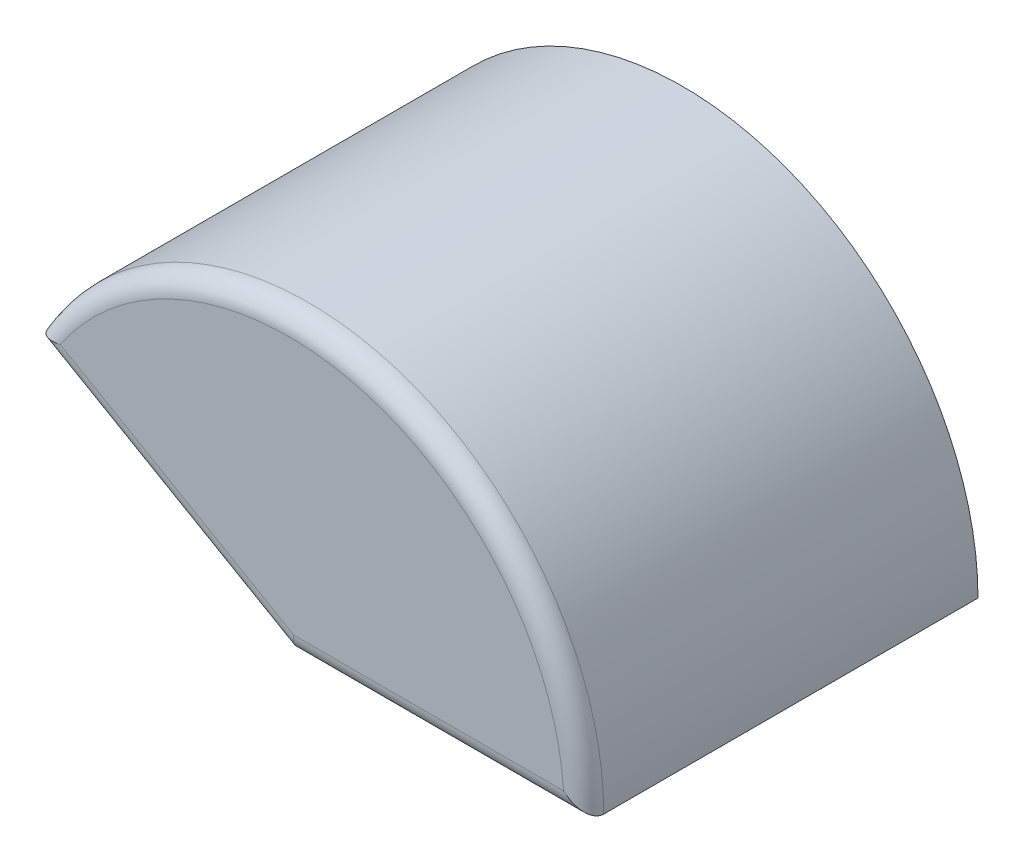
ISO-10303-21;
HEADER;
FILE_DESCRIPTION(('STEP AP214'),'2;1');
FILE_NAME('part.step','',(''),(''),'','','');
FILE_SCHEMA(('AUTOMOTIVE_DESIGN { 1 0 10303 214 1 1 1 1 }'));
ENDSEC;
DATA;
#1=APPLICATION_CONTEXT('core data for automotive mechanical design processes');
#2=APPLICATION_PROTOCOL_DEFINITION('international standard','automotive_design',2000,#1);
#3=PRODUCT_CONTEXT('',#1,'mechanical');
#4=PRODUCT('Part','Part','',(#3));
#5=PRODUCT_RELATED_PRODUCT_CATEGORY('part','',(#4));
#6=PRODUCT_DEFINITION_FORMATION('','',#4);
#7=PRODUCT_DEFINITION_CONTEXT('part definition',#1,'design');
#8=PRODUCT_DEFINITION('design','',#6,#7);
#9=PRODUCT_DEFINITION_SHAPE('','',#8);
#10=(LENGTH_UNIT() NAMED_UNIT(*) SI_UNIT(.MILLI.,.METRE.));
#11=(NAMED_UNIT(*) PLANE_ANGLE_UNIT() SI_UNIT($,.RADIAN.));
#12=(NAMED_UNIT(*) SI_UNIT($,.STERADIAN.) SOLID_ANGLE_UNIT());
#13=UNCERTAINTY_MEASURE_WITH_UNIT(LENGTH_MEASURE(1.E-05),#10,'distance_accuracy_value','');
#14=(GEOMETRIC_REPRESENTATION_CONTEXT(3) GLOBAL_UNCERTAINTY_ASSIGNED_CONTEXT((#13)) GLOBAL_UNIT_ASSIGNED_CONTEXT((#10,
#11,#12)) REPRESENTATION_CONTEXT('',''));
#15=CARTESIAN_POINT('',(0.,0.,0.));
#16=DIRECTION('',(0.,0.,1.));
#17=DIRECTION('',(1.,0.,0.));
#18=AXIS2_PLACEMENT_3D('',#15,#16,#17);
#19=CARTESIAN_POINT('',(0.,0.,40.));
#20=DIRECTION('',(0.,1.,0.));
#21=DIRECTION('',(0.,0.,1.));
#22=AXIS2_PLACEMENT_3D('',#19,#20,#21);
#23=PLANE('',#22);
#24=DIRECTION('',(0.,0.,-1.));
#25=VECTOR('',#24,1.);
#26=CARTESIAN_POINT('',(30.,0.,40.));
#27=LINE('',#26,#25);
#28=CARTESIAN_POINT('',(30.,0.,38.));
#29=VERTEX_POINT('',#28);
#30=CARTESIAN_POINT('',(30.,0.,0.));
#31=VERTEX_POINT('',#30);
#32=EDGE_CURVE('E96',#29,#31,#27,.T.);
#33=ORIENTED_EDGE('',*,*,#32,.F.);
#34=DIRECTION('',(1.,0.,0.));
#35=VECTOR('',#34,1.);
#36=CARTESIAN_POINT('',(0.,0.,38.));
#37=LINE('',#36,#35);
#38=CARTESIAN_POINT('',(0.,0.,38.));
#39=VERTEX_POINT('',#38);
#40=EDGE_CURVE('E11',#29,#39,#37,.F.);
#41=ORIENTED_EDGE('',*,*,#40,.T.);
#42=DIRECTION('',(0.,0.,-1.));
#43=VECTOR('',#42,1.);
#44=CARTESIAN_POINT('',(0.,0.,40.));
#45=LINE('',#44,#43);
#46=CARTESIAN_POINT('',(0.,0.,0.));
#47=VERTEX_POINT('',#46);
#48=EDGE_CURVE('E117',#39,#47,#45,.T.);
#49=ORIENTED_EDGE('',*,*,#48,.T.);
#50=DIRECTION('',(1.,0.,0.));
#51=VECTOR('',#50,1.);
#52=CARTESIAN_POINT('',(0.,0.,0.));
#53=LINE('',#52,#51);
#54=EDGE_CURVE('E111',#47,#31,#53,.T.);
#55=ORIENTED_EDGE('',*,*,#54,.T.);
#56=EDGE_LOOP('',(#33,#41,#49,#55));
#57=FACE_BOUND('',#56,.T.);
#58=ADVANCED_FACE('F45',(#57),#23,.F.);
#59=CARTESIAN_POINT('',(0.,0.,40.));
#60=DIRECTION('',(0.,0.,-1.));
#61=DIRECTION('',(-1.,0.,0.));
#62=AXIS2_PLACEMENT_3D('',#59,#60,#61);
#63=CYLINDRICAL_SURFACE('',#62,30.);
#64=DIRECTION('',(0.,0.,-1.));
#65=VECTOR('',#64,1.);
#66=CARTESIAN_POINT('',(-25.9807621135331,15.,40.));
#67=LINE('',#66,#65);
#68=CARTESIAN_POINT('',(-25.9807621135331,15.,38.));
#69=VERTEX_POINT('',#68);
#70=CARTESIAN_POINT('',(-25.9807621135331,15.,0.));
#71=VERTEX_POINT('',#70);
#72=EDGE_CURVE('E106',#69,#71,#67,.T.);
#73=ORIENTED_EDGE('',*,*,#72,.F.);
#74=CARTESIAN_POINT('',(0.,0.,38.));
#75=DIRECTION('',(0.,0.,1.));
#76=DIRECTION('',(1.,0.,0.));
#77=AXIS2_PLACEMENT_3D('',#74,#75,#76);
#78=CIRCLE('',#77,30.);
#79=EDGE_CURVE('E61',#69,#29,#78,.F.);
#80=ORIENTED_EDGE('',*,*,#79,.T.);
#81=ORIENTED_EDGE('',*,*,#32,.T.);
#82=CARTESIAN_POINT('',(0.,0.,0.));
#83=DIRECTION('',(0.,0.,1.));
#84=DIRECTION('',(1.,0.,0.));
#85=AXIS2_PLACEMENT_3D('',#82,#83,#84);
#86=CIRCLE('',#85,30.);
#87=EDGE_CURVE('E99',#31,#71,#86,.T.);
#88=ORIENTED_EDGE('',*,*,#87,.T.);
#89=EDGE_LOOP('',(#73,#80,#81,#88));
#90=FACE_BOUND('',#89,.T.);
#91=ADVANCED_FACE('F98',(#90),#63,.T.);
#92=CARTESIAN_POINT('',(-25.9807621135331,15.,40.));
#93=DIRECTION('',(0.500000000000001,0.866025403784438,0.));
#94=DIRECTION('',(-0.866025403784438,0.500000000000001,0.));
#95=AXIS2_PLACEMENT_3D('',#92,#93,#94);
#96=PLANE('',#95);
#97=ORIENTED_EDGE('',*,*,#48,.F.);
#98=DIRECTION('',(0.866025403784438,-0.500000000000001,0.));
#99=VECTOR('',#98,1.);
#100=CARTESIAN_POINT('',(-25.9807621135331,15.,38.));
#101=LINE('',#100,#99);
#102=EDGE_CURVE('E138',#39,#69,#101,.F.);
#103=ORIENTED_EDGE('',*,*,#102,.T.);
#104=ORIENTED_EDGE('',*,*,#72,.T.);
#105=DIRECTION('',(0.866025403784438,-0.500000000000001,0.));
#106=VECTOR('',#105,1.);
#107=CARTESIAN_POINT('',(-25.9807621135331,15.,0.));
#108=LINE('',#107,#106);
#109=EDGE_CURVE('E113',#71,#47,#108,.T.);
#110=ORIENTED_EDGE('',*,*,#109,.T.);
#111=EDGE_LOOP('',(#97,#103,#104,#110));
#112=FACE_BOUND('',#111,.T.);
#113=ADVANCED_FACE('F166',(#112),#96,.F.);
#114=CARTESIAN_POINT('',(0.,0.,40.));
#115=DIRECTION('',(0.,0.,1.));
#116=DIRECTION('',(1.,0.,0.));
#117=AXIS2_PLACEMENT_3D('',#114,#115,#116);
#118=PLANE('',#117);
#119=CARTESIAN_POINT('',(0.,0.,40.));
#120=DIRECTION('',(0.,0.,1.));
#121=DIRECTION('',(1.,0.,0.));
#122=AXIS2_PLACEMENT_3D('',#119,#120,#121);
#123=CIRCLE('',#122,28.);
#124=CARTESIAN_POINT('',(27.9284800875379,2.,40.));
#125=VERTEX_POINT('',#124);
#126=CARTESIAN_POINT('',(-23.1867732448956,15.6962908513378,40.));
#127=VERTEX_POINT('',#126);
#128=EDGE_CURVE('E131',#125,#127,#123,.T.);
#129=ORIENTED_EDGE('',*,*,#128,.T.);
#130=DIRECTION('',(0.866025403784438,-0.500000000000001,0.));
#131=VECTOR('',#130,1.);
#132=CARTESIAN_POINT('',(1.,1.73205080756888,40.));
#133=LINE('',#132,#131);
#134=CARTESIAN_POINT('',(0.535898384862254,2.,40.));
#135=VERTEX_POINT('',#134);
#136=EDGE_CURVE('E134',#127,#135,#133,.T.);
#137=ORIENTED_EDGE('',*,*,#136,.T.);
#138=DIRECTION('',(1.,0.,0.));
#139=VECTOR('',#138,1.);
#140=CARTESIAN_POINT('',(30.,2.,40.));
#141=LINE('',#140,#139);
#142=EDGE_CURVE('E105',#135,#125,#141,.T.);
#143=ORIENTED_EDGE('',*,*,#142,.T.);
#144=EDGE_LOOP('',(#129,#137,#143));
#145=FACE_BOUND('',#144,.T.);
#146=ADVANCED_FACE('F171',(#145),#118,.T.);
#147=CARTESIAN_POINT('',(0.,0.,0.));
#148=DIRECTION('',(0.,0.,1.));
#149=DIRECTION('',(1.,0.,0.));
#150=AXIS2_PLACEMENT_3D('',#147,#148,#149);
#151=PLANE('',#150);
#152=ORIENTED_EDGE('',*,*,#54,.F.);
#153=ORIENTED_EDGE('',*,*,#109,.F.);
#154=ORIENTED_EDGE('',*,*,#87,.F.);
#155=EDGE_LOOP('',(#152,#153,#154));
#156=FACE_BOUND('',#155,.T.);
#157=ADVANCED_FACE('F110',(#156),#151,.F.);
#158=CARTESIAN_POINT('',(0.,0.,38.));
#159=DIRECTION('',(0.,0.,1.));
#160=DIRECTION('',(1.,0.,0.));
#161=AXIS2_PLACEMENT_3D('',#158,#159,#160);
#162=TOROIDAL_SURFACE('',#161,28.,2.);
#163=CARTESIAN_POINT('',(-25.9807621135331,15.,38.));
#164=CARTESIAN_POINT('',(-25.9807768607065,14.9999957131051,38.0447211538198));
#165=CARTESIAN_POINT('',(-25.9787136001139,15.0005488904247,38.0894339981516));
#166=CARTESIAN_POINT('',(-25.9705446087622,15.0027372873878,38.1784293595428));
#167=CARTESIAN_POINT('',(-25.9644419275569,15.004371690761,38.2227121756812));
#168=CARTESIAN_POINT('',(-25.948374412137,15.0086717908121,38.3101373492371));
#169=CARTESIAN_POINT('',(-25.938442116244,15.0113287985946,38.3532861281529));
#170=CARTESIAN_POINT('',(-25.9149193255199,15.017615066842,38.4384940148708));
#171=CARTESIAN_POINT('',(-25.9013283332713,15.0212444595072,38.4805529736537));
#172=CARTESIAN_POINT('',(-25.8555031892532,15.0334664500465,38.6044329525649));
#173=CARTESIAN_POINT('',(-25.8181548334719,15.0434095397582,38.6842808742413));
#174=CARTESIAN_POINT('',(-25.7320295495063,15.0662544694341,38.8371489192167));
#175=CARTESIAN_POINT('',(-25.6832276624827,15.0791627696824,38.9101536369692));
#176=CARTESIAN_POINT('',(-25.5550561600951,15.1129147447849,39.0762926884686));
#177=CARTESIAN_POINT('',(-25.4712680031388,15.1348671715087,39.1657969945517));
#178=CARTESIAN_POINT('',(-25.2908441592374,15.1817859162308,39.3297433978041));
#179=CARTESIAN_POINT('',(-25.194184621506,15.2067578212521,39.4041568695761));
#180=CARTESIAN_POINT('',(-24.9513933034709,15.2689597231072,39.5655140083165));
#181=CARTESIAN_POINT('',(-24.800932555361,15.3070990029546,39.6455730450071));
#182=CARTESIAN_POINT('',(-24.4894847479776,15.3850143049846,39.7801432448796));
#183=CARTESIAN_POINT('',(-24.3284831267762,15.4247925620192,39.834618178019));
#184=CARTESIAN_POINT('',(-24.0064866118812,15.5032328478875,39.9186804824366));
#185=CARTESIAN_POINT('',(-23.8456985993334,15.5418837395817,39.9490904229671));
#186=CARTESIAN_POINT('',(-23.5217628569926,15.6186407476757,39.9895515876642));
#187=CARTESIAN_POINT('',(-23.358620420021,15.6567477899255,39.9996429368554));
#188=CARTESIAN_POINT('',(-23.1925917353267,15.6949525043544,39.9999968915332));
#189=CARTESIAN_POINT('',(-23.1896824825995,15.6956217697444,39.9999999943847));
#190=CARTESIAN_POINT('',(-23.1867732448956,15.6962908513378,40.));
#191=B_SPLINE_CURVE_WITH_KNOTS('',3,(#163,#164,#165,#166,#167,#168,#169,#170,#171,#172,#173,
#174,#175,#176,#177,#178,#179,#180,#181,#182,#183,#184,#185,#186,#187,#188,#189,#190),
.UNSPECIFIED.,.F.,.F.,(4,2,2,2,2,2,2,2,2,2,2,2,2,4),(0.,0.134098935404812,0.268096748334079,
0.400980282067466,0.53388189109451,0.79870811345966,1.06411687701312,1.43569690669508,
1.80797531621147,2.32909023766685,2.85094090925616,3.35407421615456,3.85621296025091,
3.86516868204515),.UNSPECIFIED.);
#192=EDGE_CURVE('E76',#127,#69,#191,.F.);
#193=ORIENTED_EDGE('',*,*,#192,.F.);
#194=ORIENTED_EDGE('',*,*,#128,.F.);
#195=CARTESIAN_POINT('',(30.,0.,38.));
#196=CARTESIAN_POINT('',(30.0000106279793,-1.10861465947106E-05,38.0447211538198));
#197=CARTESIAN_POINT('',(29.9985003805513,0.00149960976124195,38.0894339981516));
#198=CARTESIAN_POINT('',(29.992520024999,0.00747931280073649,38.1784293595428));
#199=CARTESIAN_POINT('',(29.9880521497306,0.0119460882446329,38.2227121756812));
#200=CARTESIAN_POINT('',(29.9762873232268,0.0237038418376657,38.3101373492371));
#201=CARTESIAN_POINT('',(29.9690142065568,0.0309710260217811,38.3532861281529));
#202=CARTESIAN_POINT('',(29.9517860063455,0.0481764893811488,38.4384940148708));
#203=CARTESIAN_POINT('',(29.9418305581282,0.0581151317538373,38.4805529736537));
#204=CARTESIAN_POINT('',(29.9082558145461,0.0916122580547029,38.6044329525649));
#205=CARTESIAN_POINT('',(29.8808827345057,0.118897404227776,38.6842808742413));
#206=CARTESIAN_POINT('',(29.8177185155214,0.181744335657633,38.8371489192167));
#207=CARTESIAN_POINT('',(29.7819089917305,0.217324195104081,38.9101536369692));
#208=CARTESIAN_POINT('',(29.6877852021728,0.310640014164507,39.0762926884686));
#209=CARTESIAN_POINT('',(29.6261987430743,0.37154545186026,39.1657969945517));
#210=CARTESIAN_POINT('',(29.4934064831683,0.502390198653938,39.3297433978041));
#211=CARTESIAN_POINT('',(29.4221828204855,0.572346271648987,39.4041568695761));
#212=CARTESIAN_POINT('',(29.2430203221763,0.747610357836809,39.5655140083165));
#213=CARTESIAN_POINT('',(29.1317871319644,0.855870317121655,39.6455730450071));
#214=CARTESIAN_POINT('',(28.9010230698325,1.0790708517148,39.7801432448796));
#215=CARTESIAN_POINT('',(28.7814807043389,1.19402064342571,39.834618178019));
#216=CARTESIAN_POINT('',(28.5418436854439,1.42295018111525,39.9186804824366));
#217=CARTESIAN_POINT('',(28.4219226278005,1.53681684147527,39.9490904229671));
#218=CARTESIAN_POINT('',(28.1797645497868,1.76525823157366,39.9895515876642));
#219=CARTESIAN_POINT('',(28.0575325760591,1.87983111671101,39.9996429368554));
#220=CARTESIAN_POINT('',(27.9328498745712,1.99593171229768,39.9999968915332));
#221=CARTESIAN_POINT('',(27.9306650204984,1.99796593949094,39.9999999943847));
#222=CARTESIAN_POINT('',(27.9284800875379,2.,40.));
#223=B_SPLINE_CURVE_WITH_KNOTS('',3,(#195,#196,#197,#198,#199,#200,#201,#202,#203,#204,#205,
#206,#207,#208,#209,#210,#211,#212,#213,#214,#215,#216,#217,#218,#219,#220,#221,#222),
.UNSPECIFIED.,.F.,.F.,(4,2,2,2,2,2,2,2,2,2,2,2,2,4),(0.,0.134098935404812,0.268096748334078,
0.400980282067467,0.53388189109451,0.798708113459659,1.06411687701312,1.43569690669508,
1.80797531621147,2.32909023766686,2.85094090925617,3.35407421615456,3.85621296025089,
3.86516868204514),.UNSPECIFIED.);
#224=EDGE_CURVE('E50',#29,#125,#223,.T.);
#225=ORIENTED_EDGE('',*,*,#224,.F.);
#226=ORIENTED_EDGE('',*,*,#79,.F.);
#227=EDGE_LOOP('',(#193,#194,#225,#226));
#228=FACE_BOUND('',#227,.T.);
#229=ADVANCED_FACE('F151',(#228),#162,.T.);
#230=CARTESIAN_POINT('',(0.,2.,38.));
#231=DIRECTION('',(-1.,0.,0.));
#232=DIRECTION('',(0.,0.,1.));
#233=AXIS2_PLACEMENT_3D('',#230,#231,#232);
#234=CYLINDRICAL_SURFACE('',#233,2.);
#235=ORIENTED_EDGE('',*,*,#224,.T.);
#236=ORIENTED_EDGE('',*,*,#142,.F.);
#237=CARTESIAN_POINT('',(0.535898384862253,2.,38.));
#238=DIRECTION('',(-0.965925826289068,0.258819045102521,0.));
#239=DIRECTION('',(-0.258819045102521,-0.965925826289068,0.));
#240=AXIS2_PLACEMENT_3D('',#237,#238,#239);
#241=ELLIPSE('',#240,2.07055236082017,2.);
#242=EDGE_CURVE('E144',#39,#135,#241,.T.);
#243=ORIENTED_EDGE('',*,*,#242,.F.);
#244=ORIENTED_EDGE('',*,*,#40,.F.);
#245=EDGE_LOOP('',(#235,#236,#243,#244));
#246=FACE_BOUND('',#245,.T.);
#247=ADVANCED_FACE('F47',(#246),#234,.T.);
#248=CARTESIAN_POINT('',(1.,1.73205080756888,38.));
#249=DIRECTION('',(-0.866025403784438,0.500000000000001,0.));
#250=DIRECTION('',(-0.500000000000001,-0.866025403784438,0.));
#251=AXIS2_PLACEMENT_3D('',#248,#249,#250);
#252=CYLINDRICAL_SURFACE('',#251,2.);
#253=ORIENTED_EDGE('',*,*,#192,.T.);
#254=ORIENTED_EDGE('',*,*,#102,.F.);
#255=ORIENTED_EDGE('',*,*,#242,.T.);
#256=ORIENTED_EDGE('',*,*,#136,.F.);
#257=EDGE_LOOP('',(#253,#254,#255,#256));
#258=FACE_BOUND('',#257,.T.);
#259=ADVANCED_FACE('F154',(#258),#252,.T.);
#260=CLOSED_SHELL('',(#58,#91,#113,#146,#157,#229,#247,#259));
#261=MANIFOLD_SOLID_BREP('B2',#260);
#262=ADVANCED_BREP_SHAPE_REPRESENTATION('',(#18,#261),#14);
#263=SHAPE_DEFINITION_REPRESENTATION(#9,#262);
ENDSEC;
END-ISO-10303-21;
